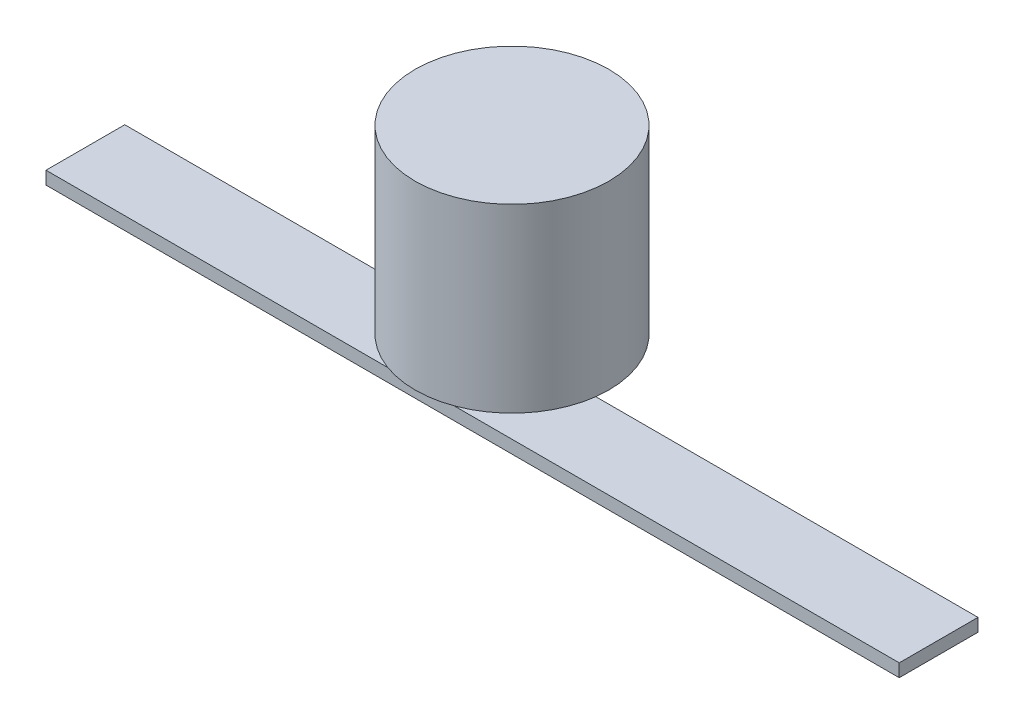
ISO-10303-21;
HEADER;
FILE_DESCRIPTION(('STEP AP214'),'2;1');
FILE_NAME('part.step','',(''),(''),'','','');
FILE_SCHEMA(('AUTOMOTIVE_DESIGN { 1 0 10303 214 1 1 1 1 }'));
ENDSEC;
DATA;
#1=APPLICATION_CONTEXT('core data for automotive mechanical design processes');
#2=APPLICATION_PROTOCOL_DEFINITION('international standard','automotive_design',2000,#1);
#3=PRODUCT_CONTEXT('',#1,'mechanical');
#4=PRODUCT('Part','Part','',(#3));
#5=PRODUCT_RELATED_PRODUCT_CATEGORY('part','',(#4));
#6=PRODUCT_DEFINITION_FORMATION('','',#4);
#7=PRODUCT_DEFINITION_CONTEXT('part definition',#1,'design');
#8=PRODUCT_DEFINITION('design','',#6,#7);
#9=PRODUCT_DEFINITION_SHAPE('','',#8);
#10=(LENGTH_UNIT() NAMED_UNIT(*) SI_UNIT(.MILLI.,.METRE.));
#11=(NAMED_UNIT(*) PLANE_ANGLE_UNIT() SI_UNIT($,.RADIAN.));
#12=(NAMED_UNIT(*) SI_UNIT($,.STERADIAN.) SOLID_ANGLE_UNIT());
#13=UNCERTAINTY_MEASURE_WITH_UNIT(LENGTH_MEASURE(1.E-05),#10,'distance_accuracy_value','');
#14=(GEOMETRIC_REPRESENTATION_CONTEXT(3) GLOBAL_UNCERTAINTY_ASSIGNED_CONTEXT((#13)) GLOBAL_UNIT_ASSIGNED_CONTEXT((#10,
#11,#12)) REPRESENTATION_CONTEXT('',''));
#15=CARTESIAN_POINT('',(0.,0.,0.));
#16=DIRECTION('',(0.,0.,1.));
#17=DIRECTION('',(1.,0.,0.));
#18=AXIS2_PLACEMENT_3D('',#15,#16,#17);
#19=CARTESIAN_POINT('',(165.1,5.,15.24));
#20=DIRECTION('',(-1.,0.,0.));
#21=DIRECTION('',(0.,0.,1.));
#22=AXIS2_PLACEMENT_3D('',#19,#20,#21);
#23=PLANE('',#22);
#24=DIRECTION('',(0.,0.,-1.));
#25=VECTOR('',#24,1.);
#26=CARTESIAN_POINT('',(165.1,0.,15.24));
#27=LINE('',#26,#25);
#28=CARTESIAN_POINT('',(165.1,0.,15.24));
#29=VERTEX_POINT('',#28);
#30=CARTESIAN_POINT('',(165.1,0.,-15.24));
#31=VERTEX_POINT('',#30);
#32=EDGE_CURVE('E98',#29,#31,#27,.T.);
#33=ORIENTED_EDGE('',*,*,#32,.T.);
#34=DIRECTION('',(0.,-1.,0.));
#35=VECTOR('',#34,1.);
#36=CARTESIAN_POINT('',(165.1,5.,-15.24));
#37=LINE('',#36,#35);
#38=CARTESIAN_POINT('',(165.1,5.,-15.24));
#39=VERTEX_POINT('',#38);
#40=EDGE_CURVE('E40',#39,#31,#37,.T.);
#41=ORIENTED_EDGE('',*,*,#40,.F.);
#42=DIRECTION('',(0.,0.,-1.));
#43=VECTOR('',#42,1.);
#44=CARTESIAN_POINT('',(165.1,5.,15.24));
#45=LINE('',#44,#43);
#46=CARTESIAN_POINT('',(165.1,5.,15.24));
#47=VERTEX_POINT('',#46);
#48=EDGE_CURVE('E84',#47,#39,#45,.T.);
#49=ORIENTED_EDGE('',*,*,#48,.F.);
#50=DIRECTION('',(0.,-1.,0.));
#51=VECTOR('',#50,1.);
#52=CARTESIAN_POINT('',(165.1,5.,15.24));
#53=LINE('',#52,#51);
#54=EDGE_CURVE('E94',#47,#29,#53,.T.);
#55=ORIENTED_EDGE('',*,*,#54,.T.);
#56=EDGE_LOOP('',(#33,#41,#49,#55));
#57=FACE_BOUND('',#56,.T.);
#58=ADVANCED_FACE('F32',(#57),#23,.F.);
#59=CARTESIAN_POINT('',(-165.1,5.,-15.24));
#60=DIRECTION('',(0.,0.,1.));
#61=DIRECTION('',(1.,0.,0.));
#62=AXIS2_PLACEMENT_3D('',#59,#60,#61);
#63=PLANE('',#62);
#64=DIRECTION('',(-1.,0.,0.));
#65=VECTOR('',#64,1.);
#66=CARTESIAN_POINT('',(-165.1,0.,-15.24));
#67=LINE('',#66,#65);
#68=CARTESIAN_POINT('',(-165.1,0.,-15.24));
#69=VERTEX_POINT('',#68);
#70=EDGE_CURVE('E89',#31,#69,#67,.T.);
#71=ORIENTED_EDGE('',*,*,#70,.T.);
#72=DIRECTION('',(0.,-1.,0.));
#73=VECTOR('',#72,1.);
#74=CARTESIAN_POINT('',(-165.1,5.,-15.24));
#75=LINE('',#74,#73);
#76=CARTESIAN_POINT('',(-165.1,5.,-15.24));
#77=VERTEX_POINT('',#76);
#78=EDGE_CURVE('E87',#77,#69,#75,.T.);
#79=ORIENTED_EDGE('',*,*,#78,.F.);
#80=DIRECTION('',(-1.,0.,0.));
#81=VECTOR('',#80,1.);
#82=CARTESIAN_POINT('',(-165.1,5.,-15.24));
#83=LINE('',#82,#81);
#84=EDGE_CURVE('E79',#39,#77,#83,.T.);
#85=ORIENTED_EDGE('',*,*,#84,.F.);
#86=ORIENTED_EDGE('',*,*,#40,.T.);
#87=EDGE_LOOP('',(#71,#79,#85,#86));
#88=FACE_BOUND('',#87,.T.);
#89=ADVANCED_FACE('F88',(#88),#63,.F.);
#90=CARTESIAN_POINT('',(-165.1,5.,15.24));
#91=DIRECTION('',(1.,0.,0.));
#92=DIRECTION('',(0.,0.,-1.));
#93=AXIS2_PLACEMENT_3D('',#90,#91,#92);
#94=PLANE('',#93);
#95=DIRECTION('',(0.,0.,1.));
#96=VECTOR('',#95,1.);
#97=CARTESIAN_POINT('',(-165.1,0.,15.24));
#98=LINE('',#97,#96);
#99=CARTESIAN_POINT('',(-165.1,0.,15.24));
#100=VERTEX_POINT('',#99);
#101=EDGE_CURVE('E65',#69,#100,#98,.T.);
#102=ORIENTED_EDGE('',*,*,#101,.T.);
#103=DIRECTION('',(0.,-1.,0.));
#104=VECTOR('',#103,1.);
#105=CARTESIAN_POINT('',(-165.1,5.,15.24));
#106=LINE('',#105,#104);
#107=CARTESIAN_POINT('',(-165.1,5.,15.24));
#108=VERTEX_POINT('',#107);
#109=EDGE_CURVE('E90',#108,#100,#106,.T.);
#110=ORIENTED_EDGE('',*,*,#109,.F.);
#111=DIRECTION('',(0.,0.,1.));
#112=VECTOR('',#111,1.);
#113=CARTESIAN_POINT('',(-165.1,5.,15.24));
#114=LINE('',#113,#112);
#115=EDGE_CURVE('E82',#77,#108,#114,.T.);
#116=ORIENTED_EDGE('',*,*,#115,.F.);
#117=ORIENTED_EDGE('',*,*,#78,.T.);
#118=EDGE_LOOP('',(#102,#110,#116,#117));
#119=FACE_BOUND('',#118,.T.);
#120=ADVANCED_FACE('F92',(#119),#94,.F.);
#121=CARTESIAN_POINT('',(-165.1,5.,15.24));
#122=DIRECTION('',(0.,0.,-1.));
#123=DIRECTION('',(-1.,0.,0.));
#124=AXIS2_PLACEMENT_3D('',#121,#122,#123);
#125=PLANE('',#124);
#126=DIRECTION('',(1.,0.,0.));
#127=VECTOR('',#126,1.);
#128=CARTESIAN_POINT('',(-165.1,0.,15.24));
#129=LINE('',#128,#127);
#130=EDGE_CURVE('E71',#100,#29,#129,.T.);
#131=ORIENTED_EDGE('',*,*,#130,.T.);
#132=ORIENTED_EDGE('',*,*,#54,.F.);
#133=DIRECTION('',(1.,0.,0.));
#134=VECTOR('',#133,1.);
#135=CARTESIAN_POINT('',(-165.1,5.,15.24));
#136=LINE('',#135,#134);
#137=EDGE_CURVE('E48',#108,#47,#136,.T.);
#138=ORIENTED_EDGE('',*,*,#137,.F.);
#139=ORIENTED_EDGE('',*,*,#109,.T.);
#140=EDGE_LOOP('',(#131,#132,#138,#139));
#141=FACE_BOUND('',#140,.T.);
#142=ADVANCED_FACE('F120',(#141),#125,.F.);
#143=CARTESIAN_POINT('',(0.,5.,0.));
#144=DIRECTION('',(0.,-1.,0.));
#145=DIRECTION('',(0.,0.,-1.));
#146=AXIS2_PLACEMENT_3D('',#143,#144,#145);
#147=PLANE('',#146);
#148=CARTESIAN_POINT('',(0.,5.,0.));
#149=DIRECTION('',(0.,-1.,0.));
#150=DIRECTION('',(0.,0.,-1.));
#151=AXIS2_PLACEMENT_3D('',#148,#149,#150);
#152=CIRCLE('',#151,7.5);
#153=CARTESIAN_POINT('',(0.,5.,-7.5));
#154=VERTEX_POINT('',#153);
#155=EDGE_CURVE('E11',#154,#154,#152,.F.);
#156=ORIENTED_EDGE('',*,*,#155,.F.);
#157=EDGE_LOOP('',(#156));
#158=FACE_BOUND('',#157,.T.);
#159=ORIENTED_EDGE('',*,*,#48,.T.);
#160=ORIENTED_EDGE('',*,*,#84,.T.);
#161=ORIENTED_EDGE('',*,*,#115,.T.);
#162=ORIENTED_EDGE('',*,*,#137,.T.);
#163=EDGE_LOOP('',(#159,#160,#161,#162));
#164=FACE_BOUND('',#163,.T.);
#165=ADVANCED_FACE('F80',(#158,#164),#147,.F.);
#166=CARTESIAN_POINT('',(0.,0.,0.));
#167=DIRECTION('',(0.,-1.,0.));
#168=DIRECTION('',(0.,0.,-1.));
#169=AXIS2_PLACEMENT_3D('',#166,#167,#168);
#170=PLANE('',#169);
#171=ORIENTED_EDGE('',*,*,#32,.F.);
#172=ORIENTED_EDGE('',*,*,#130,.F.);
#173=ORIENTED_EDGE('',*,*,#101,.F.);
#174=ORIENTED_EDGE('',*,*,#70,.F.);
#175=EDGE_LOOP('',(#171,#172,#173,#174));
#176=FACE_BOUND('',#175,.T.);
#177=ADVANCED_FACE('F109',(#176),#170,.T.);
#178=CARTESIAN_POINT('',(0.,25.,0.));
#179=DIRECTION('',(0.,-1.,0.));
#180=DIRECTION('',(0.,0.,-1.));
#181=AXIS2_PLACEMENT_3D('',#178,#179,#180);
#182=CYLINDRICAL_SURFACE('',#181,7.5);
#183=CARTESIAN_POINT('',(0.,25.,0.));
#184=DIRECTION('',(0.,1.,0.));
#185=DIRECTION('',(0.,0.,1.));
#186=AXIS2_PLACEMENT_3D('',#183,#184,#185);
#187=CIRCLE('',#186,7.5);
#188=CARTESIAN_POINT('',(0.,25.,7.5));
#189=VERTEX_POINT('',#188);
#190=EDGE_CURVE('E101',#189,#189,#187,.T.);
#191=ORIENTED_EDGE('',*,*,#190,.F.);
#192=EDGE_LOOP('',(#191));
#193=FACE_BOUND('',#192,.T.);
#194=ORIENTED_EDGE('',*,*,#155,.T.);
#195=EDGE_LOOP('',(#194));
#196=FACE_BOUND('',#195,.T.);
#197=ADVANCED_FACE('F111',(#193,#196),#182,.T.);
#198=CARTESIAN_POINT('',(0.,95.,0.));
#199=DIRECTION('',(0.,-1.,0.));
#200=DIRECTION('',(0.,0.,-1.));
#201=AXIS2_PLACEMENT_3D('',#198,#199,#200);
#202=CYLINDRICAL_SURFACE('',#201,37.5);
#203=CARTESIAN_POINT('',(0.,95.,0.));
#204=DIRECTION('',(0.,1.,0.));
#205=DIRECTION('',(0.,0.,1.));
#206=AXIS2_PLACEMENT_3D('',#203,#204,#205);
#207=CIRCLE('',#206,37.5);
#208=CARTESIAN_POINT('',(0.,95.,37.5));
#209=VERTEX_POINT('',#208);
#210=EDGE_CURVE('E189',#209,#209,#207,.T.);
#211=ORIENTED_EDGE('',*,*,#210,.F.);
#212=EDGE_LOOP('',(#211));
#213=FACE_BOUND('',#212,.T.);
#214=CARTESIAN_POINT('',(0.,25.,0.));
#215=DIRECTION('',(0.,1.,0.));
#216=DIRECTION('',(0.,0.,1.));
#217=AXIS2_PLACEMENT_3D('',#214,#215,#216);
#218=CIRCLE('',#217,37.5);
#219=CARTESIAN_POINT('',(0.,25.,37.5));
#220=VERTEX_POINT('',#219);
#221=EDGE_CURVE('E187',#220,#220,#218,.T.);
#222=ORIENTED_EDGE('',*,*,#221,.T.);
#223=EDGE_LOOP('',(#222));
#224=FACE_BOUND('',#223,.T.);
#225=ADVANCED_FACE('F117',(#213,#224),#202,.T.);
#226=CARTESIAN_POINT('',(0.,95.,0.));
#227=DIRECTION('',(0.,1.,0.));
#228=DIRECTION('',(0.,0.,1.));
#229=AXIS2_PLACEMENT_3D('',#226,#227,#228);
#230=PLANE('',#229);
#231=ORIENTED_EDGE('',*,*,#210,.T.);
#232=EDGE_LOOP('',(#231));
#233=FACE_BOUND('',#232,.T.);
#234=ADVANCED_FACE('F158',(#233),#230,.T.);
#235=CARTESIAN_POINT('',(0.,25.,0.));
#236=DIRECTION('',(0.,1.,0.));
#237=DIRECTION('',(0.,0.,1.));
#238=AXIS2_PLACEMENT_3D('',#235,#236,#237);
#239=PLANE('',#238);
#240=ORIENTED_EDGE('',*,*,#190,.T.);
#241=EDGE_LOOP('',(#240));
#242=FACE_BOUND('',#241,.T.);
#243=ORIENTED_EDGE('',*,*,#221,.F.);
#244=EDGE_LOOP('',(#243));
#245=FACE_BOUND('',#244,.T.);
#246=ADVANCED_FACE('F168',(#242,#245),#239,.F.);
#247=CLOSED_SHELL('',(#58,#89,#120,#142,#165,#177,#197,#225,#234,#246));
#248=MANIFOLD_SOLID_BREP('B2',#247);
#249=ADVANCED_BREP_SHAPE_REPRESENTATION('',(#18,#248),#14);
#250=SHAPE_DEFINITION_REPRESENTATION(#9,#249);
ENDSEC;
END-ISO-10303-21;
